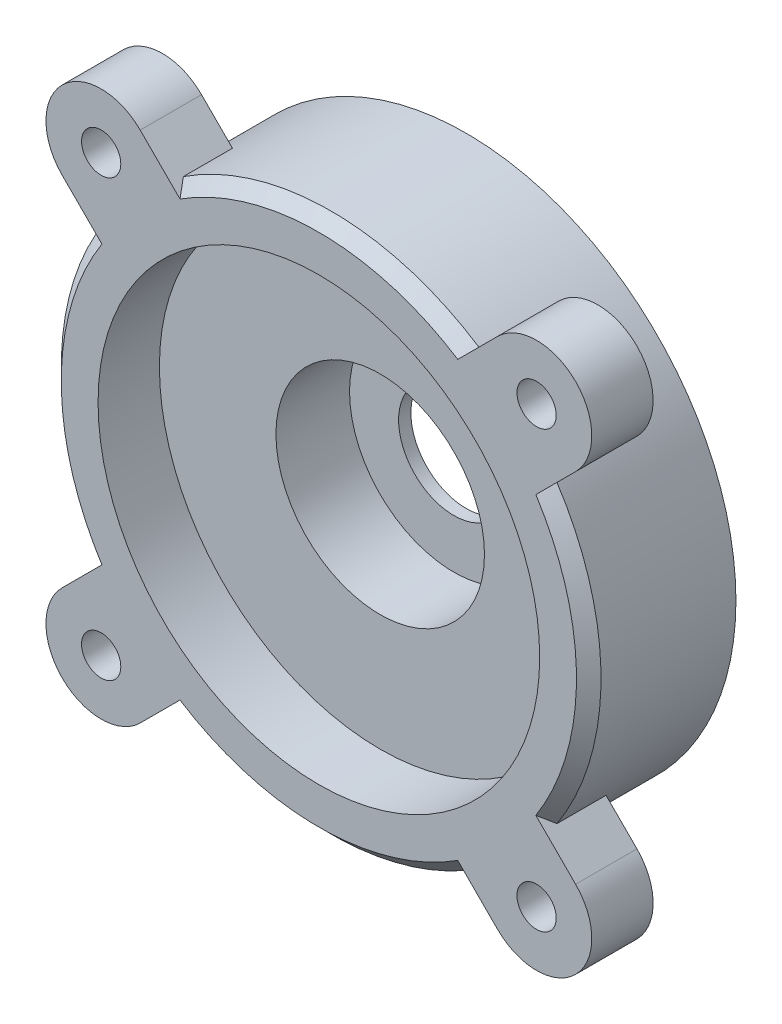
ISO-10303-21;
HEADER;
FILE_DESCRIPTION(('STEP AP214'),'2;1');
FILE_NAME('part.step','',(''),(''),'','','');
FILE_SCHEMA(('AUTOMOTIVE_DESIGN { 1 0 10303 214 1 1 1 1 }'));
ENDSEC;
DATA;
#1=APPLICATION_CONTEXT('core data for automotive mechanical design processes');
#2=APPLICATION_PROTOCOL_DEFINITION('international standard','automotive_design',2000,#1);
#3=PRODUCT_CONTEXT('',#1,'mechanical');
#4=PRODUCT('Part','Part','',(#3));
#5=PRODUCT_RELATED_PRODUCT_CATEGORY('part','',(#4));
#6=PRODUCT_DEFINITION_FORMATION('','',#4);
#7=PRODUCT_DEFINITION_CONTEXT('part definition',#1,'design');
#8=PRODUCT_DEFINITION('design','',#6,#7);
#9=PRODUCT_DEFINITION_SHAPE('','',#8);
#10=(LENGTH_UNIT() NAMED_UNIT(*) SI_UNIT(.MILLI.,.METRE.));
#11=(NAMED_UNIT(*) PLANE_ANGLE_UNIT() SI_UNIT($,.RADIAN.));
#12=(NAMED_UNIT(*) SI_UNIT($,.STERADIAN.) SOLID_ANGLE_UNIT());
#13=UNCERTAINTY_MEASURE_WITH_UNIT(LENGTH_MEASURE(1.E-05),#10,'distance_accuracy_value','');
#14=(GEOMETRIC_REPRESENTATION_CONTEXT(3) GLOBAL_UNCERTAINTY_ASSIGNED_CONTEXT((#13)) GLOBAL_UNIT_ASSIGNED_CONTEXT((#10,
#11,#12)) REPRESENTATION_CONTEXT('',''));
#15=CARTESIAN_POINT('',(0.,0.,0.));
#16=DIRECTION('',(0.,0.,1.));
#17=DIRECTION('',(1.,0.,0.));
#18=AXIS2_PLACEMENT_3D('',#15,#16,#17);
#19=CARTESIAN_POINT('',(0.,0.,6.));
#20=DIRECTION('',(0.,0.,-1.));
#21=DIRECTION('',(-1.,0.,0.));
#22=AXIS2_PLACEMENT_3D('',#19,#20,#21);
#23=CONICAL_SURFACE('',#22,21.,0.785398163397448);
#24=CARTESIAN_POINT('',(-11.3221844044348,17.6861454351131,6.0002));
#25=CARTESIAN_POINT('',(-11.442817573575,17.8067786042533,5.83355757009398));
#26=CARTESIAN_POINT('',(-11.5634193156647,17.9273803463431,5.66686968833641));
#27=CARTESIAN_POINT('',(-11.8045599453449,18.1685209760232,5.33340302166944));
#28=CARTESIAN_POINT('',(-11.9250988329356,18.2890598636139,5.16662423676034));
#29=CARTESIAN_POINT('',(-12.045606293476,18.4095673241543,4.9998));
#30=B_SPLINE_CURVE_WITH_KNOTS('',3,(#24,#25,#26,#27,#28,#29),.UNSPECIFIED.,.F.,.F.,(4,2,4),(0.,
0.715450692106055,1.43090138184667),.UNSPECIFIED.);
#31=CARTESIAN_POINT('',(-11.3223291890206,17.686290219699,6.));
#32=VERTEX_POINT('',#31);
#33=CARTESIAN_POINT('',(-12.045461817502,18.4094228481803,5.00000000000001));
#34=VERTEX_POINT('',#33);
#35=EDGE_CURVE('E716',#32,#34,#30,.T.);
#36=ORIENTED_EDGE('',*,*,#35,.F.);
#37=CARTESIAN_POINT('',(0.,0.,6.));
#38=DIRECTION('',(0.,0.,1.));
#39=DIRECTION('',(1.,0.,0.));
#40=AXIS2_PLACEMENT_3D('',#37,#38,#39);
#41=CIRCLE('',#40,21.);
#42=CARTESIAN_POINT('',(11.3223291890208,17.6862902196998,6.));
#43=VERTEX_POINT('',#42);
#44=EDGE_CURVE('E321',#43,#32,#41,.T.);
#45=ORIENTED_EDGE('',*,*,#44,.F.);
#46=CARTESIAN_POINT('',(12.0456062934756,18.4095673241546,4.99980000000001));
#47=CARTESIAN_POINT('',(11.9250988329352,18.2890598636141,5.16662423676035));
#48=CARTESIAN_POINT('',(11.8045599453445,18.1685209760235,5.33340302166944));
#49=CARTESIAN_POINT('',(11.5634193156643,17.9273803463433,5.66686968833641));
#50=CARTESIAN_POINT('',(11.4428175735746,17.8067786042535,5.83355757009398));
#51=CARTESIAN_POINT('',(11.3221844044344,17.6861454351134,6.0002));
#52=B_SPLINE_CURVE_WITH_KNOTS('',3,(#46,#47,#48,#49,#50,#51),.UNSPECIFIED.,.F.,.F.,(4,2,4),(0.,
0.715450689740613,1.43090138184667),.UNSPECIFIED.);
#53=CARTESIAN_POINT('',(12.0454618175016,18.4094228481805,5.00000000000001));
#54=VERTEX_POINT('',#53);
#55=EDGE_CURVE('E329',#54,#43,#52,.T.);
#56=ORIENTED_EDGE('',*,*,#55,.F.);
#57=CARTESIAN_POINT('',(0.,0.,5.00000000000001));
#58=DIRECTION('',(0.,0.,1.));
#59=DIRECTION('',(1.,0.,0.));
#60=AXIS2_PLACEMENT_3D('',#57,#58,#59);
#61=CIRCLE('',#60,22.);
#62=EDGE_CURVE('E324',#34,#54,#61,.F.);
#63=ORIENTED_EDGE('',*,*,#62,.F.);
#64=EDGE_LOOP('',(#36,#45,#56,#63));
#65=FACE_BOUND('',#64,.T.);
#66=ADVANCED_FACE('F36',(#65),#23,.T.);
#67=CARTESIAN_POINT('',(-18.4095673241548,12.0456062934752,4.99980000000001));
#68=CARTESIAN_POINT('',(-18.2890598636144,11.9250988329348,5.16662423676035));
#69=CARTESIAN_POINT('',(-18.1685209760237,11.8045599453442,5.33340302166944));
#70=CARTESIAN_POINT('',(-17.9273803463436,11.563419315664,5.66686968833641));
#71=CARTESIAN_POINT('',(-17.8067786042538,11.4428175735742,5.83355757009398));
#72=CARTESIAN_POINT('',(-17.6861454351136,11.322184404434,6.0002));
#73=B_SPLINE_CURVE_WITH_KNOTS('',3,(#67,#68,#69,#70,#71,#72),.UNSPECIFIED.,.F.,.F.,(4,2,4),(0.,
0.715450689740612,1.43090138184667),.UNSPECIFIED.);
#74=CARTESIAN_POINT('',(-18.4094228481808,12.0454618175012,5.00000000000001));
#75=VERTEX_POINT('',#74);
#76=CARTESIAN_POINT('',(-17.6862902196996,11.32232918902,6.));
#77=VERTEX_POINT('',#76);
#78=EDGE_CURVE('E209',#75,#77,#73,.T.);
#79=ORIENTED_EDGE('',*,*,#78,.F.);
#80=CARTESIAN_POINT('',(-18.4094228481799,-12.0454618175025,5.00000000000001));
#81=VERTEX_POINT('',#80);
#82=EDGE_CURVE('E754',#81,#75,#61,.F.);
#83=ORIENTED_EDGE('',*,*,#82,.F.);
#84=CARTESIAN_POINT('',(-17.6861454351128,-11.3221844044354,6.0002));
#85=CARTESIAN_POINT('',(-17.8067786042529,-11.4428175735755,5.83355757009397));
#86=CARTESIAN_POINT('',(-17.9273803463427,-11.5634193156653,5.66686968833641));
#87=CARTESIAN_POINT('',(-18.1685209760229,-11.8045599453455,5.33340302166944));
#88=CARTESIAN_POINT('',(-18.2890598636135,-11.9250988329361,5.16662423676035));
#89=CARTESIAN_POINT('',(-18.409567324154,-12.0456062934766,4.99980000000001));
#90=B_SPLINE_CURVE_WITH_KNOTS('',3,(#84,#85,#86,#87,#88,#89),.UNSPECIFIED.,.F.,.F.,(4,2,4),(0.,
0.71545069210605,1.43090138184666),.UNSPECIFIED.);
#91=CARTESIAN_POINT('',(-17.6862902196988,-11.3223291890214,6.));
#92=VERTEX_POINT('',#91);
#93=EDGE_CURVE('E244',#92,#81,#90,.T.);
#94=ORIENTED_EDGE('',*,*,#93,.F.);
#95=EDGE_CURVE('E325',#77,#92,#41,.T.);
#96=ORIENTED_EDGE('',*,*,#95,.F.);
#97=EDGE_LOOP('',(#79,#83,#94,#96));
#98=FACE_BOUND('',#97,.T.);
#99=ADVANCED_FACE('F372',(#98),#23,.T.);
#100=CARTESIAN_POINT('',(-12.0456062934747,-18.4095673241552,4.99980000000001));
#101=CARTESIAN_POINT('',(-11.9250988329342,-18.2890598636147,5.16662423676035));
#102=CARTESIAN_POINT('',(-11.8045599453436,-18.1685209760241,5.33340302166944));
#103=CARTESIAN_POINT('',(-11.5634193156634,-17.9273803463439,5.66686968833641));
#104=CARTESIAN_POINT('',(-11.4428175735736,-17.8067786042541,5.83355757009398));
#105=CARTESIAN_POINT('',(-11.3221844044335,-17.686145435114,6.0002));
#106=B_SPLINE_CURVE_WITH_KNOTS('',3,(#100,#101,#102,#103,#104,#105),.UNSPECIFIED.,.F.,.F.,(4,2,
4),(0.,0.715450689740616,1.43090138184667),.UNSPECIFIED.);
#107=CARTESIAN_POINT('',(-12.0454618175006,-18.4094228481812,5.00000000000001));
#108=VERTEX_POINT('',#107);
#109=CARTESIAN_POINT('',(-11.3223291890198,-17.6862902197004,6.));
#110=VERTEX_POINT('',#109);
#111=EDGE_CURVE('E743',#108,#110,#106,.T.);
#112=ORIENTED_EDGE('',*,*,#111,.F.);
#113=CARTESIAN_POINT('',(12.0454618175022,-18.4094228481801,5.00000000000001));
#114=VERTEX_POINT('',#113);
#115=EDGE_CURVE('E330',#114,#108,#61,.F.);
#116=ORIENTED_EDGE('',*,*,#115,.F.);
#117=CARTESIAN_POINT('',(11.322184404435,-17.686145435113,6.0002));
#118=CARTESIAN_POINT('',(11.4428175735752,-17.8067786042532,5.83355757009398));
#119=CARTESIAN_POINT('',(11.5634193156649,-17.9273803463429,5.66686968833641));
#120=CARTESIAN_POINT('',(11.8045599453451,-18.1685209760231,5.33340302166944));
#121=CARTESIAN_POINT('',(11.9250988329358,-18.2890598636137,5.16662423676035));
#122=CARTESIAN_POINT('',(12.0456062934762,-18.4095673241542,4.99980000000001));
#123=B_SPLINE_CURVE_WITH_KNOTS('',3,(#117,#118,#119,#120,#121,#122),.UNSPECIFIED.,.F.,.F.,(4,2,
4),(0.,0.715450692106052,1.43090138184666),.UNSPECIFIED.);
#124=CARTESIAN_POINT('',(11.3223291890216,-17.6862902196996,6.));
#125=VERTEX_POINT('',#124);
#126=EDGE_CURVE('E396',#125,#114,#123,.T.);
#127=ORIENTED_EDGE('',*,*,#126,.F.);
#128=EDGE_CURVE('E764',#110,#125,#41,.T.);
#129=ORIENTED_EDGE('',*,*,#128,.F.);
#130=EDGE_LOOP('',(#112,#116,#127,#129));
#131=FACE_BOUND('',#130,.T.);
#132=ADVANCED_FACE('F367',(#131),#23,.T.);
#133=CARTESIAN_POINT('',(0.,0.,6.));
#134=DIRECTION('',(0.,0.,-1.));
#135=DIRECTION('',(-1.,0.,0.));
#136=AXIS2_PLACEMENT_3D('',#133,#134,#135);
#137=CYLINDRICAL_SURFACE('',#136,22.);
#138=CARTESIAN_POINT('',(0.,0.,1.));
#139=DIRECTION('',(0.,0.,-1.));
#140=DIRECTION('',(-1.,0.,0.));
#141=AXIS2_PLACEMENT_3D('',#138,#139,#140);
#142=CIRCLE('',#141,22.);
#143=CARTESIAN_POINT('',(-18.4094228481808,12.0454618175012,1.));
#144=VERTEX_POINT('',#143);
#145=CARTESIAN_POINT('',(-12.045461817502,18.4094228481803,1.));
#146=VERTEX_POINT('',#145);
#147=EDGE_CURVE('E11',#144,#146,#142,.T.);
#148=ORIENTED_EDGE('',*,*,#147,.T.);
#149=DIRECTION('',(0.,0.,-1.));
#150=VECTOR('',#149,1.);
#151=CARTESIAN_POINT('',(-12.045461817502,18.4094228481803,6.));
#152=LINE('',#151,#150);
#153=EDGE_CURVE('E216',#146,#34,#152,.F.);
#154=ORIENTED_EDGE('',*,*,#153,.T.);
#155=ORIENTED_EDGE('',*,*,#62,.T.);
#156=DIRECTION('',(0.,0.,-1.));
#157=VECTOR('',#156,1.);
#158=CARTESIAN_POINT('',(12.0454618175016,18.4094228481805,6.));
#159=LINE('',#158,#157);
#160=CARTESIAN_POINT('',(12.0454618175016,18.4094228481805,1.));
#161=VERTEX_POINT('',#160);
#162=EDGE_CURVE('E310',#54,#161,#159,.T.);
#163=ORIENTED_EDGE('',*,*,#162,.T.);
#164=CARTESIAN_POINT('',(0.,0.,1.));
#165=DIRECTION('',(0.,0.,-1.));
#166=DIRECTION('',(-1.,0.,0.));
#167=AXIS2_PLACEMENT_3D('',#164,#165,#166);
#168=CIRCLE('',#167,22.);
#169=CARTESIAN_POINT('',(18.4094228481805,12.0454618175016,1.));
#170=VERTEX_POINT('',#169);
#171=EDGE_CURVE('E397',#161,#170,#168,.T.);
#172=ORIENTED_EDGE('',*,*,#171,.T.);
#173=DIRECTION('',(0.,0.,-1.));
#174=VECTOR('',#173,1.);
#175=CARTESIAN_POINT('',(18.4094228481805,12.0454618175016,6.));
#176=LINE('',#175,#174);
#177=CARTESIAN_POINT('',(18.4094228481805,12.0454618175016,5.00000000000001));
#178=VERTEX_POINT('',#177);
#179=EDGE_CURVE('E314',#170,#178,#176,.F.);
#180=ORIENTED_EDGE('',*,*,#179,.T.);
#181=CARTESIAN_POINT('',(18.4094228481809,-12.045461817501,5.00000000000001));
#182=VERTEX_POINT('',#181);
#183=EDGE_CURVE('E326',#178,#182,#61,.F.);
#184=ORIENTED_EDGE('',*,*,#183,.T.);
#185=DIRECTION('',(0.,0.,-1.));
#186=VECTOR('',#185,1.);
#187=CARTESIAN_POINT('',(18.4094228481809,-12.045461817501,6.));
#188=LINE('',#187,#186);
#189=CARTESIAN_POINT('',(18.4094228481809,-12.045461817501,1.));
#190=VERTEX_POINT('',#189);
#191=EDGE_CURVE('E278',#182,#190,#188,.T.);
#192=ORIENTED_EDGE('',*,*,#191,.T.);
#193=CARTESIAN_POINT('',(0.,0.,1.));
#194=DIRECTION('',(0.,0.,-1.));
#195=DIRECTION('',(-1.,0.,0.));
#196=AXIS2_PLACEMENT_3D('',#193,#194,#195);
#197=CIRCLE('',#196,22.);
#198=CARTESIAN_POINT('',(12.0454618175022,-18.4094228481802,1.));
#199=VERTEX_POINT('',#198);
#200=EDGE_CURVE('E772',#190,#199,#197,.T.);
#201=ORIENTED_EDGE('',*,*,#200,.T.);
#202=DIRECTION('',(0.,0.,-1.));
#203=VECTOR('',#202,1.);
#204=CARTESIAN_POINT('',(12.0454618175022,-18.4094228481801,6.));
#205=LINE('',#204,#203);
#206=EDGE_CURVE('E282',#199,#114,#205,.F.);
#207=ORIENTED_EDGE('',*,*,#206,.T.);
#208=ORIENTED_EDGE('',*,*,#115,.T.);
#209=DIRECTION('',(0.,0.,-1.));
#210=VECTOR('',#209,1.);
#211=CARTESIAN_POINT('',(-12.0454618175006,-18.4094228481812,6.));
#212=LINE('',#211,#210);
#213=CARTESIAN_POINT('',(-12.0454618175006,-18.4094228481812,1.));
#214=VERTEX_POINT('',#213);
#215=EDGE_CURVE('E740',#108,#214,#212,.T.);
#216=ORIENTED_EDGE('',*,*,#215,.T.);
#217=CARTESIAN_POINT('',(0.,0.,1.));
#218=DIRECTION('',(0.,0.,-1.));
#219=DIRECTION('',(-1.,0.,0.));
#220=AXIS2_PLACEMENT_3D('',#217,#218,#219);
#221=CIRCLE('',#220,22.);
#222=CARTESIAN_POINT('',(-18.4094228481799,-12.0454618175025,1.));
#223=VERTEX_POINT('',#222);
#224=EDGE_CURVE('E45',#214,#223,#221,.T.);
#225=ORIENTED_EDGE('',*,*,#224,.T.);
#226=DIRECTION('',(0.,0.,-1.));
#227=VECTOR('',#226,1.);
#228=CARTESIAN_POINT('',(-18.4094228481799,-12.0454618175025,6.));
#229=LINE('',#228,#227);
#230=EDGE_CURVE('E252',#223,#81,#229,.F.);
#231=ORIENTED_EDGE('',*,*,#230,.T.);
#232=ORIENTED_EDGE('',*,*,#82,.T.);
#233=DIRECTION('',(0.,0.,-1.));
#234=VECTOR('',#233,1.);
#235=CARTESIAN_POINT('',(-18.4094228481808,12.0454618175012,6.));
#236=LINE('',#235,#234);
#237=EDGE_CURVE('E206',#75,#144,#236,.T.);
#238=ORIENTED_EDGE('',*,*,#237,.T.);
#239=EDGE_LOOP('',(#148,#154,#155,#163,#172,#180,#184,#192,#201,#207,#208,#216,#225,#231,#232,#238));
#240=FACE_BOUND('',#239,.T.);
#241=CARTESIAN_POINT('',(0.,0.,-6.));
#242=DIRECTION('',(0.,0.,1.));
#243=DIRECTION('',(1.,0.,0.));
#244=AXIS2_PLACEMENT_3D('',#241,#242,#243);
#245=CIRCLE('',#244,22.);
#246=CARTESIAN_POINT('',(22.,0.,-6.));
#247=VERTEX_POINT('',#246);
#248=EDGE_CURVE('E317',#247,#247,#245,.T.);
#249=ORIENTED_EDGE('',*,*,#248,.T.);
#250=EDGE_LOOP('',(#249));
#251=FACE_BOUND('',#250,.T.);
#252=ADVANCED_FACE('F362',(#240,#251),#137,.T.);
#253=CARTESIAN_POINT('',(0.,0.,6.));
#254=DIRECTION('',(0.,0.,1.));
#255=DIRECTION('',(1.,0.,0.));
#256=AXIS2_PLACEMENT_3D('',#253,#254,#255);
#257=PLANE('',#256);
#258=CARTESIAN_POINT('',(0.,0.,6.));
#259=DIRECTION('',(0.,0.,1.));
#260=DIRECTION('',(1.,0.,0.));
#261=AXIS2_PLACEMENT_3D('',#258,#259,#260);
#262=CIRCLE('',#261,18.);
#263=CARTESIAN_POINT('',(18.,0.,6.));
#264=VERTEX_POINT('',#263);
#265=EDGE_CURVE('E690',#264,#264,#262,.T.);
#266=ORIENTED_EDGE('',*,*,#265,.F.);
#267=EDGE_LOOP('',(#266));
#268=FACE_BOUND('',#267,.T.);
#269=ORIENTED_EDGE('',*,*,#44,.T.);
#270=DIRECTION('',(-0.707106781186548,0.707106781186547,0.));
#271=VECTOR('',#270,1.);
#272=CARTESIAN_POINT('',(-14.5663996924429,20.9303607231212,6.));
#273=LINE('',#272,#271);
#274=CARTESIAN_POINT('',(-14.5663996924429,20.9303607231212,6.));
#275=VERTEX_POINT('',#274);
#276=EDGE_CURVE('E193',#32,#275,#273,.T.);
#277=ORIENTED_EDGE('',*,*,#276,.T.);
#278=CARTESIAN_POINT('',(-17.7483802077823,17.7483802077817,6.));
#279=DIRECTION('',(0.,0.,1.));
#280=DIRECTION('',(-1.,0.,0.));
#281=AXIS2_PLACEMENT_3D('',#278,#279,#280);
#282=CIRCLE('',#281,4.50000000000002);
#283=CARTESIAN_POINT('',(-20.9303607231218,14.5663996924422,6.));
#284=VERTEX_POINT('',#283);
#285=EDGE_CURVE('E202',#275,#284,#282,.T.);
#286=ORIENTED_EDGE('',*,*,#285,.T.);
#287=DIRECTION('',(0.707106781186548,-0.707106781186548,0.));
#288=VECTOR('',#287,1.);
#289=CARTESIAN_POINT('',(-20.9303607231218,14.5663996924422,6.));
#290=LINE('',#289,#288);
#291=EDGE_CURVE('E180',#284,#77,#290,.T.);
#292=ORIENTED_EDGE('',*,*,#291,.T.);
#293=ORIENTED_EDGE('',*,*,#95,.T.);
#294=DIRECTION('',(-0.707106781186547,-0.707106781186548,0.));
#295=VECTOR('',#294,1.);
#296=CARTESIAN_POINT('',(-20.930360723121,-14.5663996924436,6.));
#297=LINE('',#296,#295);
#298=CARTESIAN_POINT('',(-20.930360723121,-14.5663996924436,6.));
#299=VERTEX_POINT('',#298);
#300=EDGE_CURVE('E726',#92,#299,#297,.T.);
#301=ORIENTED_EDGE('',*,*,#300,.T.);
#302=CARTESIAN_POINT('',(-17.7483802077815,-17.7483802077831,6.));
#303=DIRECTION('',(0.,0.,1.));
#304=DIRECTION('',(-1.,0.,0.));
#305=AXIS2_PLACEMENT_3D('',#302,#303,#304);
#306=CIRCLE('',#305,4.50000000000002);
#307=CARTESIAN_POINT('',(-14.566399692442,-20.9303607231226,6.));
#308=VERTEX_POINT('',#307);
#309=EDGE_CURVE('E719',#299,#308,#306,.T.);
#310=ORIENTED_EDGE('',*,*,#309,.T.);
#311=DIRECTION('',(0.707106781186547,0.707106781186548,0.));
#312=VECTOR('',#311,1.);
#313=CARTESIAN_POINT('',(-14.566399692442,-20.9303607231226,6.));
#314=LINE('',#313,#312);
#315=EDGE_CURVE('E733',#308,#110,#314,.T.);
#316=ORIENTED_EDGE('',*,*,#315,.T.);
#317=ORIENTED_EDGE('',*,*,#128,.T.);
#318=DIRECTION('',(0.707106781186548,-0.707106781186547,0.));
#319=VECTOR('',#318,1.);
#320=CARTESIAN_POINT('',(14.5663996924438,-20.9303607231218,6.));
#321=LINE('',#320,#319);
#322=CARTESIAN_POINT('',(14.5663996924438,-20.9303607231218,6.));
#323=VERTEX_POINT('',#322);
#324=EDGE_CURVE('E264',#125,#323,#321,.T.);
#325=ORIENTED_EDGE('',*,*,#324,.T.);
#326=CARTESIAN_POINT('',(17.7483802077833,-17.7483802077823,6.));
#327=DIRECTION('',(0.,0.,1.));
#328=DIRECTION('',(-1.,0.,0.));
#329=AXIS2_PLACEMENT_3D('',#326,#327,#328);
#330=CIRCLE('',#329,4.50000000000002);
#331=CARTESIAN_POINT('',(20.9303607231227,-14.5663996924428,6.));
#332=VERTEX_POINT('',#331);
#333=EDGE_CURVE('E257',#323,#332,#330,.T.);
#334=ORIENTED_EDGE('',*,*,#333,.T.);
#335=DIRECTION('',(-0.707106781186548,0.707106781186547,0.));
#336=VECTOR('',#335,1.);
#337=CARTESIAN_POINT('',(20.9303607231227,-14.5663996924428,6.));
#338=LINE('',#337,#336);
#339=CARTESIAN_POINT('',(17.6862902196987,-11.3223291890225,6.));
#340=VERTEX_POINT('',#339);
#341=EDGE_CURVE('E272',#332,#340,#338,.T.);
#342=ORIENTED_EDGE('',*,*,#341,.T.);
#343=CARTESIAN_POINT('',(17.6862902196998,11.3223291890208,6.));
#344=VERTEX_POINT('',#343);
#345=EDGE_CURVE('E320',#340,#344,#41,.T.);
#346=ORIENTED_EDGE('',*,*,#345,.T.);
#347=DIRECTION('',(0.707106781186547,0.707106781186548,0.));
#348=VECTOR('',#347,1.);
#349=CARTESIAN_POINT('',(20.930360723122,14.566399692443,6.));
#350=LINE('',#349,#348);
#351=CARTESIAN_POINT('',(20.930360723122,14.566399692443,6.));
#352=VERTEX_POINT('',#351);
#353=EDGE_CURVE('E296',#344,#352,#350,.T.);
#354=ORIENTED_EDGE('',*,*,#353,.T.);
#355=CARTESIAN_POINT('',(17.7483802077825,17.7483802077825,6.));
#356=DIRECTION('',(0.,0.,1.));
#357=DIRECTION('',(-1.,0.,0.));
#358=AXIS2_PLACEMENT_3D('',#355,#356,#357);
#359=CIRCLE('',#358,4.50000000000002);
#360=CARTESIAN_POINT('',(14.566399692443,20.930360723122,6.));
#361=VERTEX_POINT('',#360);
#362=EDGE_CURVE('E289',#352,#361,#359,.T.);
#363=ORIENTED_EDGE('',*,*,#362,.T.);
#364=DIRECTION('',(-0.707106781186547,-0.707106781186548,0.));
#365=VECTOR('',#364,1.);
#366=CARTESIAN_POINT('',(14.566399692443,20.930360723122,6.));
#367=LINE('',#366,#365);
#368=EDGE_CURVE('E304',#361,#43,#367,.T.);
#369=ORIENTED_EDGE('',*,*,#368,.T.);
#370=EDGE_LOOP('',(#269,#277,#286,#292,#293,#301,#310,#316,#317,#325,#334,#342,#346,#354,#363,#369));
#371=FACE_BOUND('',#370,.T.);
#372=CARTESIAN_POINT('',(17.7483802077825,17.7483802077825,6.));
#373=DIRECTION('',(0.,0.,1.));
#374=DIRECTION('',(1.,0.,0.));
#375=AXIS2_PLACEMENT_3D('',#372,#373,#374);
#376=CIRCLE('',#375,1.59999999999981);
#377=CARTESIAN_POINT('',(19.3483802077823,17.7483802077825,6.));
#378=VERTEX_POINT('',#377);
#379=EDGE_CURVE('E285',#378,#378,#376,.T.);
#380=ORIENTED_EDGE('',*,*,#379,.F.);
#381=EDGE_LOOP('',(#380));
#382=FACE_BOUND('',#381,.T.);
#383=CARTESIAN_POINT('',(17.7483802077833,-17.7483802077823,6.));
#384=DIRECTION('',(0.,0.,1.));
#385=DIRECTION('',(1.,0.,0.));
#386=AXIS2_PLACEMENT_3D('',#383,#384,#385);
#387=CIRCLE('',#386,1.59999999999979);
#388=CARTESIAN_POINT('',(19.3483802077831,-17.7483802077823,6.));
#389=VERTEX_POINT('',#388);
#390=EDGE_CURVE('E251',#389,#389,#387,.T.);
#391=ORIENTED_EDGE('',*,*,#390,.F.);
#392=EDGE_LOOP('',(#391));
#393=FACE_BOUND('',#392,.T.);
#394=CARTESIAN_POINT('',(-17.7483802077815,-17.7483802077831,6.));
#395=DIRECTION('',(0.,0.,1.));
#396=DIRECTION('',(1.,0.,0.));
#397=AXIS2_PLACEMENT_3D('',#394,#395,#396);
#398=CIRCLE('',#397,1.60000000000064);
#399=CARTESIAN_POINT('',(-16.1483802077809,-17.7483802077831,6.));
#400=VERTEX_POINT('',#399);
#401=EDGE_CURVE('E713',#400,#400,#398,.T.);
#402=ORIENTED_EDGE('',*,*,#401,.F.);
#403=EDGE_LOOP('',(#402));
#404=FACE_BOUND('',#403,.T.);
#405=CARTESIAN_POINT('',(-17.7483802077823,17.7483802077817,6.));
#406=DIRECTION('',(0.,0.,1.));
#407=DIRECTION('',(1.,0.,0.));
#408=AXIS2_PLACEMENT_3D('',#405,#406,#407);
#409=CIRCLE('',#408,1.60000000000074);
#410=CARTESIAN_POINT('',(-16.1483802077816,17.7483802077817,6.));
#411=VERTEX_POINT('',#410);
#412=EDGE_CURVE('E198',#411,#411,#409,.T.);
#413=ORIENTED_EDGE('',*,*,#412,.F.);
#414=EDGE_LOOP('',(#413));
#415=FACE_BOUND('',#414,.T.);
#416=ADVANCED_FACE('F358',(#268,#371,#382,#393,#404,#415),#257,.T.);
#417=CARTESIAN_POINT('',(0.,0.,-6.));
#418=DIRECTION('',(0.,0.,1.));
#419=DIRECTION('',(1.,0.,0.));
#420=AXIS2_PLACEMENT_3D('',#417,#418,#419);
#421=PLANE('',#420);
#422=CARTESIAN_POINT('',(0.,0.,-6.));
#423=DIRECTION('',(0.,0.,1.));
#424=DIRECTION('',(1.,0.,0.));
#425=AXIS2_PLACEMENT_3D('',#422,#423,#424);
#426=CIRCLE('',#425,4.5);
#427=CARTESIAN_POINT('',(4.5,0.,-6.));
#428=VERTEX_POINT('',#427);
#429=EDGE_CURVE('E679',#428,#428,#426,.T.);
#430=ORIENTED_EDGE('',*,*,#429,.T.);
#431=EDGE_LOOP('',(#430));
#432=FACE_BOUND('',#431,.T.);
#433=ORIENTED_EDGE('',*,*,#248,.F.);
#434=EDGE_LOOP('',(#433));
#435=FACE_BOUND('',#434,.T.);
#436=ADVANCED_FACE('F361',(#432,#435),#421,.F.);
#437=CARTESIAN_POINT('',(18.409567324155,-12.045606293475,4.99980000000001));
#438=CARTESIAN_POINT('',(18.2890598636145,-11.9250988329346,5.16662423676035));
#439=CARTESIAN_POINT('',(18.1685209760239,-11.804559945344,5.33340302166944));
#440=CARTESIAN_POINT('',(17.9273803463437,-11.5634193156638,5.66686968833641));
#441=CARTESIAN_POINT('',(17.8067786042539,-11.442817573574,5.83355757009398));
#442=CARTESIAN_POINT('',(17.6861454351138,-11.3221844044338,6.0002));
#443=B_SPLINE_CURVE_WITH_KNOTS('',3,(#437,#438,#439,#440,#441,#442),.UNSPECIFIED.,.F.,.F.,(4,2,
4),(0.,0.715450689740612,1.43090138184667),.UNSPECIFIED.);
#444=EDGE_CURVE('E392',#182,#340,#443,.T.);
#445=ORIENTED_EDGE('',*,*,#444,.F.);
#446=ORIENTED_EDGE('',*,*,#183,.F.);
#447=CARTESIAN_POINT('',(17.6861454351134,11.3221844044344,6.0002));
#448=CARTESIAN_POINT('',(17.8067786042535,11.4428175735746,5.83355757009397));
#449=CARTESIAN_POINT('',(17.9273803463433,11.5634193156644,5.6668696883364));
#450=CARTESIAN_POINT('',(18.1685209760235,11.8045599453445,5.33340302166944));
#451=CARTESIAN_POINT('',(18.2890598636141,11.9250988329352,5.16662423676034));
#452=CARTESIAN_POINT('',(18.4095673241546,12.0456062934756,4.9998));
#453=B_SPLINE_CURVE_WITH_KNOTS('',3,(#447,#448,#449,#450,#451,#452),.UNSPECIFIED.,.F.,.F.,(4,2,
4),(0.,0.715450692106056,1.43090138184667),.UNSPECIFIED.);
#454=EDGE_CURVE('E338',#344,#178,#453,.T.);
#455=ORIENTED_EDGE('',*,*,#454,.F.);
#456=ORIENTED_EDGE('',*,*,#345,.F.);
#457=EDGE_LOOP('',(#445,#446,#455,#456));
#458=FACE_BOUND('',#457,.T.);
#459=ADVANCED_FACE('F38',(#458),#23,.T.);
#460=CARTESIAN_POINT('',(20.930360723122,14.566399692443,1.));
#461=DIRECTION('',(0.707106781186548,-0.707106781186547,0.));
#462=DIRECTION('',(0.707106781186547,0.707106781186548,0.));
#463=AXIS2_PLACEMENT_3D('',#460,#461,#462);
#464=PLANE('',#463);
#465=ORIENTED_EDGE('',*,*,#179,.F.);
#466=DIRECTION('',(0.707106781186547,0.707106781186548,0.));
#467=VECTOR('',#466,1.);
#468=CARTESIAN_POINT('',(20.930360723122,14.566399692443,1.));
#469=LINE('',#468,#467);
#470=CARTESIAN_POINT('',(20.930360723122,14.566399692443,1.));
#471=VERTEX_POINT('',#470);
#472=EDGE_CURVE('E299',#170,#471,#469,.T.);
#473=ORIENTED_EDGE('',*,*,#472,.T.);
#474=DIRECTION('',(0.,0.,1.));
#475=VECTOR('',#474,1.);
#476=CARTESIAN_POINT('',(20.930360723122,14.566399692443,1.));
#477=LINE('',#476,#475);
#478=EDGE_CURVE('E308',#471,#352,#477,.T.);
#479=ORIENTED_EDGE('',*,*,#478,.T.);
#480=ORIENTED_EDGE('',*,*,#353,.F.);
#481=ORIENTED_EDGE('',*,*,#454,.T.);
#482=EDGE_LOOP('',(#465,#473,#479,#480,#481));
#483=FACE_BOUND('',#482,.T.);
#484=ADVANCED_FACE('F350',(#483),#464,.T.);
#485=CARTESIAN_POINT('',(14.566399692443,20.930360723122,1.));
#486=DIRECTION('',(-0.707106781186548,0.707106781186547,0.));
#487=DIRECTION('',(-0.707106781186547,-0.707106781186548,0.));
#488=AXIS2_PLACEMENT_3D('',#485,#486,#487);
#489=PLANE('',#488);
#490=ORIENTED_EDGE('',*,*,#162,.F.);
#491=ORIENTED_EDGE('',*,*,#55,.T.);
#492=ORIENTED_EDGE('',*,*,#368,.F.);
#493=DIRECTION('',(0.,0.,1.));
#494=VECTOR('',#493,1.);
#495=CARTESIAN_POINT('',(14.566399692443,20.930360723122,1.));
#496=LINE('',#495,#494);
#497=CARTESIAN_POINT('',(14.566399692443,20.930360723122,1.));
#498=VERTEX_POINT('',#497);
#499=EDGE_CURVE('E301',#498,#361,#496,.T.);
#500=ORIENTED_EDGE('',*,*,#499,.F.);
#501=DIRECTION('',(-0.707106781186547,-0.707106781186548,0.));
#502=VECTOR('',#501,1.);
#503=CARTESIAN_POINT('',(14.566399692443,20.930360723122,1.));
#504=LINE('',#503,#502);
#505=EDGE_CURVE('E295',#498,#161,#504,.T.);
#506=ORIENTED_EDGE('',*,*,#505,.T.);
#507=EDGE_LOOP('',(#490,#491,#492,#500,#506));
#508=FACE_BOUND('',#507,.T.);
#509=ADVANCED_FACE('F345',(#508),#489,.T.);
#510=CARTESIAN_POINT('',(17.7483802077825,17.7483802077825,1.));
#511=DIRECTION('',(0.,0.,1.));
#512=DIRECTION('',(1.,0.,0.));
#513=AXIS2_PLACEMENT_3D('',#510,#511,#512);
#514=CYLINDRICAL_SURFACE('',#513,4.50000000000002);
#515=ORIENTED_EDGE('',*,*,#362,.F.);
#516=ORIENTED_EDGE('',*,*,#478,.F.);
#517=CARTESIAN_POINT('',(17.7483802077825,17.7483802077825,1.));
#518=DIRECTION('',(0.,0.,1.));
#519=DIRECTION('',(-1.,0.,0.));
#520=AXIS2_PLACEMENT_3D('',#517,#518,#519);
#521=CIRCLE('',#520,4.50000000000002);
#522=EDGE_CURVE('E292',#471,#498,#521,.T.);
#523=ORIENTED_EDGE('',*,*,#522,.T.);
#524=ORIENTED_EDGE('',*,*,#499,.T.);
#525=EDGE_LOOP('',(#515,#516,#523,#524));
#526=FACE_BOUND('',#525,.T.);
#527=ADVANCED_FACE('F349',(#526),#514,.T.);
#528=CARTESIAN_POINT('',(17.7483802077825,17.7483802077825,1.));
#529=DIRECTION('',(0.,0.,-1.));
#530=DIRECTION('',(-1.,0.,0.));
#531=AXIS2_PLACEMENT_3D('',#528,#529,#530);
#532=PLANE('',#531);
#533=ORIENTED_EDGE('',*,*,#171,.F.);
#534=ORIENTED_EDGE('',*,*,#505,.F.);
#535=ORIENTED_EDGE('',*,*,#522,.F.);
#536=ORIENTED_EDGE('',*,*,#472,.F.);
#537=EDGE_LOOP('',(#533,#534,#535,#536));
#538=FACE_BOUND('',#537,.T.);
#539=CARTESIAN_POINT('',(17.7483802077825,17.7483802077825,1.));
#540=DIRECTION('',(0.,0.,1.));
#541=DIRECTION('',(1.,0.,0.));
#542=AXIS2_PLACEMENT_3D('',#539,#540,#541);
#543=CIRCLE('',#542,1.59999999999981);
#544=CARTESIAN_POINT('',(19.3483802077823,17.7483802077825,1.));
#545=VERTEX_POINT('',#544);
#546=EDGE_CURVE('E286',#545,#545,#543,.T.);
#547=ORIENTED_EDGE('',*,*,#546,.T.);
#548=EDGE_LOOP('',(#547));
#549=FACE_BOUND('',#548,.T.);
#550=ADVANCED_FACE('F356',(#538,#549),#532,.T.);
#551=CARTESIAN_POINT('',(17.7483802077825,17.7483802077825,1.));
#552=DIRECTION('',(0.,0.,1.));
#553=DIRECTION('',(1.,0.,0.));
#554=AXIS2_PLACEMENT_3D('',#551,#552,#553);
#555=CYLINDRICAL_SURFACE('',#554,1.59999999999981);
#556=ORIENTED_EDGE('',*,*,#546,.F.);
#557=EDGE_LOOP('',(#556));
#558=FACE_BOUND('',#557,.T.);
#559=ORIENTED_EDGE('',*,*,#379,.T.);
#560=EDGE_LOOP('',(#559));
#561=FACE_BOUND('',#560,.T.);
#562=ADVANCED_FACE('F435',(#558,#561),#555,.F.);
#563=CARTESIAN_POINT('',(14.5663996924438,-20.9303607231218,1.));
#564=DIRECTION('',(-0.707106781186547,-0.707106781186548,0.));
#565=DIRECTION('',(0.707106781186548,-0.707106781186547,0.));
#566=AXIS2_PLACEMENT_3D('',#563,#564,#565);
#567=PLANE('',#566);
#568=ORIENTED_EDGE('',*,*,#206,.F.);
#569=DIRECTION('',(0.707106781186548,-0.707106781186547,0.));
#570=VECTOR('',#569,1.);
#571=CARTESIAN_POINT('',(14.5663996924438,-20.9303607231218,1.));
#572=LINE('',#571,#570);
#573=CARTESIAN_POINT('',(14.5663996924438,-20.9303607231218,1.));
#574=VERTEX_POINT('',#573);
#575=EDGE_CURVE('E267',#199,#574,#572,.T.);
#576=ORIENTED_EDGE('',*,*,#575,.T.);
#577=DIRECTION('',(0.,0.,1.));
#578=VECTOR('',#577,1.);
#579=CARTESIAN_POINT('',(14.5663996924438,-20.9303607231218,1.));
#580=LINE('',#579,#578);
#581=EDGE_CURVE('E276',#574,#323,#580,.T.);
#582=ORIENTED_EDGE('',*,*,#581,.T.);
#583=ORIENTED_EDGE('',*,*,#324,.F.);
#584=ORIENTED_EDGE('',*,*,#126,.T.);
#585=EDGE_LOOP('',(#568,#576,#582,#583,#584));
#586=FACE_BOUND('',#585,.T.);
#587=ADVANCED_FACE('F428',(#586),#567,.T.);
#588=CARTESIAN_POINT('',(20.9303607231227,-14.5663996924428,1.));
#589=DIRECTION('',(0.707106781186547,0.707106781186548,0.));
#590=DIRECTION('',(-0.707106781186548,0.707106781186547,0.));
#591=AXIS2_PLACEMENT_3D('',#588,#589,#590);
#592=PLANE('',#591);
#593=ORIENTED_EDGE('',*,*,#191,.F.);
#594=ORIENTED_EDGE('',*,*,#444,.T.);
#595=ORIENTED_EDGE('',*,*,#341,.F.);
#596=DIRECTION('',(0.,0.,1.));
#597=VECTOR('',#596,1.);
#598=CARTESIAN_POINT('',(20.9303607231227,-14.5663996924428,1.));
#599=LINE('',#598,#597);
#600=CARTESIAN_POINT('',(20.9303607231227,-14.5663996924428,1.));
#601=VERTEX_POINT('',#600);
#602=EDGE_CURVE('E269',#601,#332,#599,.T.);
#603=ORIENTED_EDGE('',*,*,#602,.F.);
#604=DIRECTION('',(-0.707106781186548,0.707106781186547,0.));
#605=VECTOR('',#604,1.);
#606=CARTESIAN_POINT('',(20.9303607231227,-14.5663996924428,1.));
#607=LINE('',#606,#605);
#608=EDGE_CURVE('E263',#601,#190,#607,.T.);
#609=ORIENTED_EDGE('',*,*,#608,.T.);
#610=EDGE_LOOP('',(#593,#594,#595,#603,#609));
#611=FACE_BOUND('',#610,.T.);
#612=ADVANCED_FACE('F423',(#611),#592,.T.);
#613=CARTESIAN_POINT('',(17.7483802077833,-17.7483802077823,1.));
#614=DIRECTION('',(0.,0.,1.));
#615=DIRECTION('',(1.,0.,0.));
#616=AXIS2_PLACEMENT_3D('',#613,#614,#615);
#617=CYLINDRICAL_SURFACE('',#616,4.50000000000002);
#618=ORIENTED_EDGE('',*,*,#333,.F.);
#619=ORIENTED_EDGE('',*,*,#581,.F.);
#620=CARTESIAN_POINT('',(17.7483802077833,-17.7483802077823,1.));
#621=DIRECTION('',(0.,0.,1.));
#622=DIRECTION('',(-1.,0.,0.));
#623=AXIS2_PLACEMENT_3D('',#620,#621,#622);
#624=CIRCLE('',#623,4.50000000000002);
#625=EDGE_CURVE('E260',#574,#601,#624,.T.);
#626=ORIENTED_EDGE('',*,*,#625,.T.);
#627=ORIENTED_EDGE('',*,*,#602,.T.);
#628=EDGE_LOOP('',(#618,#619,#626,#627));
#629=FACE_BOUND('',#628,.T.);
#630=ADVANCED_FACE('F427',(#629),#617,.T.);
#631=CARTESIAN_POINT('',(17.7483802077833,-17.7483802077823,1.));
#632=DIRECTION('',(0.,0.,-1.));
#633=DIRECTION('',(-1.,0.,0.));
#634=AXIS2_PLACEMENT_3D('',#631,#632,#633);
#635=PLANE('',#634);
#636=ORIENTED_EDGE('',*,*,#200,.F.);
#637=ORIENTED_EDGE('',*,*,#608,.F.);
#638=ORIENTED_EDGE('',*,*,#625,.F.);
#639=ORIENTED_EDGE('',*,*,#575,.F.);
#640=EDGE_LOOP('',(#636,#637,#638,#639));
#641=FACE_BOUND('',#640,.T.);
#642=CARTESIAN_POINT('',(17.7483802077833,-17.7483802077823,1.));
#643=DIRECTION('',(0.,0.,1.));
#644=DIRECTION('',(1.,0.,0.));
#645=AXIS2_PLACEMENT_3D('',#642,#643,#644);
#646=CIRCLE('',#645,1.59999999999979);
#647=CARTESIAN_POINT('',(19.3483802077831,-17.7483802077823,1.));
#648=VERTEX_POINT('',#647);
#649=EDGE_CURVE('E254',#648,#648,#646,.T.);
#650=ORIENTED_EDGE('',*,*,#649,.T.);
#651=EDGE_LOOP('',(#650));
#652=FACE_BOUND('',#651,.T.);
#653=ADVANCED_FACE('F433',(#641,#652),#635,.T.);
#654=CARTESIAN_POINT('',(17.7483802077833,-17.7483802077823,1.));
#655=DIRECTION('',(0.,0.,1.));
#656=DIRECTION('',(1.,0.,0.));
#657=AXIS2_PLACEMENT_3D('',#654,#655,#656);
#658=CYLINDRICAL_SURFACE('',#657,1.59999999999979);
#659=ORIENTED_EDGE('',*,*,#649,.F.);
#660=EDGE_LOOP('',(#659));
#661=FACE_BOUND('',#660,.T.);
#662=ORIENTED_EDGE('',*,*,#390,.T.);
#663=EDGE_LOOP('',(#662));
#664=FACE_BOUND('',#663,.T.);
#665=ADVANCED_FACE('F467',(#661,#664),#658,.F.);
#666=CARTESIAN_POINT('',(-17.7483802077815,-17.7483802077831,1.));
#667=DIRECTION('',(0.,0.,1.));
#668=DIRECTION('',(1.,0.,0.));
#669=AXIS2_PLACEMENT_3D('',#666,#667,#668);
#670=CYLINDRICAL_SURFACE('',#669,4.50000000000002);
#671=ORIENTED_EDGE('',*,*,#309,.F.);
#672=DIRECTION('',(0.,0.,1.));
#673=VECTOR('',#672,1.);
#674=CARTESIAN_POINT('',(-20.930360723121,-14.5663996924436,1.));
#675=LINE('',#674,#673);
#676=CARTESIAN_POINT('',(-20.930360723121,-14.5663996924436,1.));
#677=VERTEX_POINT('',#676);
#678=EDGE_CURVE('E738',#677,#299,#675,.T.);
#679=ORIENTED_EDGE('',*,*,#678,.F.);
#680=CARTESIAN_POINT('',(-17.7483802077815,-17.7483802077831,1.));
#681=DIRECTION('',(0.,0.,1.));
#682=DIRECTION('',(-1.,0.,0.));
#683=AXIS2_PLACEMENT_3D('',#680,#681,#682);
#684=CIRCLE('',#683,4.50000000000002);
#685=CARTESIAN_POINT('',(-14.566399692442,-20.9303607231226,1.));
#686=VERTEX_POINT('',#685);
#687=EDGE_CURVE('E722',#677,#686,#684,.T.);
#688=ORIENTED_EDGE('',*,*,#687,.T.);
#689=DIRECTION('',(0.,0.,1.));
#690=VECTOR('',#689,1.);
#691=CARTESIAN_POINT('',(-14.566399692442,-20.9303607231226,1.));
#692=LINE('',#691,#690);
#693=EDGE_CURVE('E730',#686,#308,#692,.T.);
#694=ORIENTED_EDGE('',*,*,#693,.T.);
#695=EDGE_LOOP('',(#671,#679,#688,#694));
#696=FACE_BOUND('',#695,.T.);
#697=ADVANCED_FACE('F239',(#696),#670,.T.);
#698=CARTESIAN_POINT('',(-20.930360723121,-14.5663996924436,1.));
#699=DIRECTION('',(-0.707106781186548,0.707106781186547,0.));
#700=DIRECTION('',(-0.707106781186547,-0.707106781186548,0.));
#701=AXIS2_PLACEMENT_3D('',#698,#699,#700);
#702=PLANE('',#701);
#703=ORIENTED_EDGE('',*,*,#300,.F.);
#704=ORIENTED_EDGE('',*,*,#93,.T.);
#705=ORIENTED_EDGE('',*,*,#230,.F.);
#706=DIRECTION('',(-0.707106781186547,-0.707106781186548,0.));
#707=VECTOR('',#706,1.);
#708=CARTESIAN_POINT('',(-20.930360723121,-14.5663996924436,1.));
#709=LINE('',#708,#707);
#710=EDGE_CURVE('E60',#223,#677,#709,.T.);
#711=ORIENTED_EDGE('',*,*,#710,.T.);
#712=ORIENTED_EDGE('',*,*,#678,.T.);
#713=EDGE_LOOP('',(#703,#704,#705,#711,#712));
#714=FACE_BOUND('',#713,.T.);
#715=ADVANCED_FACE('F235',(#714),#702,.T.);
#716=CARTESIAN_POINT('',(-14.566399692442,-20.9303607231226,1.));
#717=DIRECTION('',(0.707106781186548,-0.707106781186547,0.));
#718=DIRECTION('',(0.707106781186547,0.707106781186548,0.));
#719=AXIS2_PLACEMENT_3D('',#716,#717,#718);
#720=PLANE('',#719);
#721=ORIENTED_EDGE('',*,*,#215,.F.);
#722=ORIENTED_EDGE('',*,*,#111,.T.);
#723=ORIENTED_EDGE('',*,*,#315,.F.);
#724=ORIENTED_EDGE('',*,*,#693,.F.);
#725=DIRECTION('',(0.707106781186547,0.707106781186548,0.));
#726=VECTOR('',#725,1.);
#727=CARTESIAN_POINT('',(-14.566399692442,-20.9303607231226,1.));
#728=LINE('',#727,#726);
#729=EDGE_CURVE('E725',#686,#214,#728,.T.);
#730=ORIENTED_EDGE('',*,*,#729,.T.);
#731=EDGE_LOOP('',(#721,#722,#723,#724,#730));
#732=FACE_BOUND('',#731,.T.);
#733=ADVANCED_FACE('F234',(#732),#720,.T.);
#734=CARTESIAN_POINT('',(-17.7483802077815,-17.7483802077831,1.));
#735=DIRECTION('',(0.,0.,-1.));
#736=DIRECTION('',(-1.,0.,0.));
#737=AXIS2_PLACEMENT_3D('',#734,#735,#736);
#738=PLANE('',#737);
#739=ORIENTED_EDGE('',*,*,#224,.F.);
#740=ORIENTED_EDGE('',*,*,#729,.F.);
#741=ORIENTED_EDGE('',*,*,#687,.F.);
#742=ORIENTED_EDGE('',*,*,#710,.F.);
#743=EDGE_LOOP('',(#739,#740,#741,#742));
#744=FACE_BOUND('',#743,.T.);
#745=CARTESIAN_POINT('',(-17.7483802077815,-17.7483802077831,1.));
#746=DIRECTION('',(0.,0.,1.));
#747=DIRECTION('',(1.,0.,0.));
#748=AXIS2_PLACEMENT_3D('',#745,#746,#747);
#749=CIRCLE('',#748,1.60000000000064);
#750=CARTESIAN_POINT('',(-16.1483802077809,-17.7483802077831,1.));
#751=VERTEX_POINT('',#750);
#752=EDGE_CURVE('E715',#751,#751,#749,.T.);
#753=ORIENTED_EDGE('',*,*,#752,.T.);
#754=EDGE_LOOP('',(#753));
#755=FACE_BOUND('',#754,.T.);
#756=ADVANCED_FACE('F230',(#744,#755),#738,.T.);
#757=CARTESIAN_POINT('',(-17.7483802077815,-17.7483802077831,1.));
#758=DIRECTION('',(0.,0.,1.));
#759=DIRECTION('',(1.,0.,0.));
#760=AXIS2_PLACEMENT_3D('',#757,#758,#759);
#761=CYLINDRICAL_SURFACE('',#760,1.60000000000064);
#762=ORIENTED_EDGE('',*,*,#752,.F.);
#763=EDGE_LOOP('',(#762));
#764=FACE_BOUND('',#763,.T.);
#765=ORIENTED_EDGE('',*,*,#401,.T.);
#766=EDGE_LOOP('',(#765));
#767=FACE_BOUND('',#766,.T.);
#768=ADVANCED_FACE('F227',(#764,#767),#761,.F.);
#769=CARTESIAN_POINT('',(-17.7483802077823,17.7483802077817,1.));
#770=DIRECTION('',(0.,0.,1.));
#771=DIRECTION('',(1.,0.,0.));
#772=AXIS2_PLACEMENT_3D('',#769,#770,#771);
#773=CYLINDRICAL_SURFACE('',#772,4.50000000000002);
#774=ORIENTED_EDGE('',*,*,#285,.F.);
#775=DIRECTION('',(0.,0.,1.));
#776=VECTOR('',#775,1.);
#777=CARTESIAN_POINT('',(-14.5663996924429,20.9303607231212,1.));
#778=LINE('',#777,#776);
#779=CARTESIAN_POINT('',(-14.5663996924429,20.9303607231212,1.));
#780=VERTEX_POINT('',#779);
#781=EDGE_CURVE('E185',#780,#275,#778,.T.);
#782=ORIENTED_EDGE('',*,*,#781,.F.);
#783=CARTESIAN_POINT('',(-17.7483802077823,17.7483802077817,1.));
#784=DIRECTION('',(0.,0.,1.));
#785=DIRECTION('',(-1.,0.,0.));
#786=AXIS2_PLACEMENT_3D('',#783,#784,#785);
#787=CIRCLE('',#786,4.50000000000002);
#788=CARTESIAN_POINT('',(-20.9303607231218,14.5663996924422,1.));
#789=VERTEX_POINT('',#788);
#790=EDGE_CURVE('E189',#780,#789,#787,.T.);
#791=ORIENTED_EDGE('',*,*,#790,.T.);
#792=DIRECTION('',(0.,0.,1.));
#793=VECTOR('',#792,1.);
#794=CARTESIAN_POINT('',(-20.9303607231218,14.5663996924422,1.));
#795=LINE('',#794,#793);
#796=EDGE_CURVE('E174',#789,#284,#795,.T.);
#797=ORIENTED_EDGE('',*,*,#796,.T.);
#798=EDGE_LOOP('',(#774,#782,#791,#797));
#799=FACE_BOUND('',#798,.T.);
#800=ADVANCED_FACE('F192',(#799),#773,.T.);
#801=CARTESIAN_POINT('',(-14.5663996924429,20.9303607231212,1.));
#802=DIRECTION('',(0.707106781186547,0.707106781186548,0.));
#803=DIRECTION('',(-0.707106781186548,0.707106781186547,0.));
#804=AXIS2_PLACEMENT_3D('',#801,#802,#803);
#805=PLANE('',#804);
#806=ORIENTED_EDGE('',*,*,#276,.F.);
#807=ORIENTED_EDGE('',*,*,#35,.T.);
#808=ORIENTED_EDGE('',*,*,#153,.F.);
#809=DIRECTION('',(-0.707106781186548,0.707106781186547,0.));
#810=VECTOR('',#809,1.);
#811=CARTESIAN_POINT('',(-14.5663996924429,20.9303607231212,1.));
#812=LINE('',#811,#810);
#813=EDGE_CURVE('E52',#146,#780,#812,.T.);
#814=ORIENTED_EDGE('',*,*,#813,.T.);
#815=ORIENTED_EDGE('',*,*,#781,.T.);
#816=EDGE_LOOP('',(#806,#807,#808,#814,#815));
#817=FACE_BOUND('',#816,.T.);
#818=ADVANCED_FACE('F222',(#817),#805,.T.);
#819=CARTESIAN_POINT('',(-20.9303607231218,14.5663996924422,1.));
#820=DIRECTION('',(-0.707106781186548,-0.707106781186548,0.));
#821=DIRECTION('',(0.707106781186548,-0.707106781186548,0.));
#822=AXIS2_PLACEMENT_3D('',#819,#820,#821);
#823=PLANE('',#822);
#824=ORIENTED_EDGE('',*,*,#237,.F.);
#825=ORIENTED_EDGE('',*,*,#78,.T.);
#826=ORIENTED_EDGE('',*,*,#291,.F.);
#827=ORIENTED_EDGE('',*,*,#796,.F.);
#828=DIRECTION('',(0.707106781186548,-0.707106781186548,0.));
#829=VECTOR('',#828,1.);
#830=CARTESIAN_POINT('',(-20.9303607231218,14.5663996924422,1.));
#831=LINE('',#830,#829);
#832=EDGE_CURVE('E177',#789,#144,#831,.T.);
#833=ORIENTED_EDGE('',*,*,#832,.T.);
#834=EDGE_LOOP('',(#824,#825,#826,#827,#833));
#835=FACE_BOUND('',#834,.T.);
#836=ADVANCED_FACE('F176',(#835),#823,.T.);
#837=CARTESIAN_POINT('',(-17.7483802077823,17.7483802077817,1.));
#838=DIRECTION('',(0.,0.,-1.));
#839=DIRECTION('',(-1.,0.,0.));
#840=AXIS2_PLACEMENT_3D('',#837,#838,#839);
#841=PLANE('',#840);
#842=ORIENTED_EDGE('',*,*,#147,.F.);
#843=ORIENTED_EDGE('',*,*,#832,.F.);
#844=ORIENTED_EDGE('',*,*,#790,.F.);
#845=ORIENTED_EDGE('',*,*,#813,.F.);
#846=EDGE_LOOP('',(#842,#843,#844,#845));
#847=FACE_BOUND('',#846,.T.);
#848=CARTESIAN_POINT('',(-17.7483802077823,17.7483802077817,1.));
#849=DIRECTION('',(0.,0.,1.));
#850=DIRECTION('',(1.,0.,0.));
#851=AXIS2_PLACEMENT_3D('',#848,#849,#850);
#852=CIRCLE('',#851,1.60000000000074);
#853=CARTESIAN_POINT('',(-16.1483802077816,17.7483802077817,1.));
#854=VERTEX_POINT('',#853);
#855=EDGE_CURVE('E204',#854,#854,#852,.T.);
#856=ORIENTED_EDGE('',*,*,#855,.T.);
#857=EDGE_LOOP('',(#856));
#858=FACE_BOUND('',#857,.T.);
#859=ADVANCED_FACE('F187',(#847,#858),#841,.T.);
#860=CARTESIAN_POINT('',(-17.7483802077823,17.7483802077817,1.));
#861=DIRECTION('',(0.,0.,1.));
#862=DIRECTION('',(1.,0.,0.));
#863=AXIS2_PLACEMENT_3D('',#860,#861,#862);
#864=CYLINDRICAL_SURFACE('',#863,1.60000000000074);
#865=ORIENTED_EDGE('',*,*,#855,.F.);
#866=EDGE_LOOP('',(#865));
#867=FACE_BOUND('',#866,.T.);
#868=ORIENTED_EDGE('',*,*,#412,.T.);
#869=EDGE_LOOP('',(#868));
#870=FACE_BOUND('',#869,.T.);
#871=ADVANCED_FACE('F519',(#867,#870),#864,.F.);
#872=CARTESIAN_POINT('',(0.,0.,1.));
#873=DIRECTION('',(0.,0.,1.));
#874=DIRECTION('',(1.,0.,0.));
#875=AXIS2_PLACEMENT_3D('',#872,#873,#874);
#876=CYLINDRICAL_SURFACE('',#875,18.);
#877=CARTESIAN_POINT('',(0.,0.,1.));
#878=DIRECTION('',(0.,0.,1.));
#879=DIRECTION('',(1.,0.,0.));
#880=AXIS2_PLACEMENT_3D('',#877,#878,#879);
#881=CIRCLE('',#880,18.);
#882=CARTESIAN_POINT('',(18.,0.,1.));
#883=VERTEX_POINT('',#882);
#884=EDGE_CURVE('E693',#883,#883,#881,.T.);
#885=ORIENTED_EDGE('',*,*,#884,.F.);
#886=EDGE_LOOP('',(#885));
#887=FACE_BOUND('',#886,.T.);
#888=ORIENTED_EDGE('',*,*,#265,.T.);
#889=EDGE_LOOP('',(#888));
#890=FACE_BOUND('',#889,.T.);
#891=ADVANCED_FACE('F525',(#887,#890),#876,.F.);
#892=CARTESIAN_POINT('',(0.,0.,1.));
#893=DIRECTION('',(0.,0.,1.));
#894=DIRECTION('',(1.,0.,0.));
#895=AXIS2_PLACEMENT_3D('',#892,#893,#894);
#896=PLANE('',#895);
#897=CARTESIAN_POINT('',(0.,0.,1.));
#898=DIRECTION('',(0.,0.,1.));
#899=DIRECTION('',(1.,0.,0.));
#900=AXIS2_PLACEMENT_3D('',#897,#898,#899);
#901=CIRCLE('',#900,8.5);
#902=CARTESIAN_POINT('',(8.5,0.,1.));
#903=VERTEX_POINT('',#902);
#904=EDGE_CURVE('E684',#903,#903,#901,.T.);
#905=ORIENTED_EDGE('',*,*,#904,.F.);
#906=EDGE_LOOP('',(#905));
#907=FACE_BOUND('',#906,.T.);
#908=ORIENTED_EDGE('',*,*,#884,.T.);
#909=EDGE_LOOP('',(#908));
#910=FACE_BOUND('',#909,.T.);
#911=ADVANCED_FACE('F534',(#907,#910),#896,.T.);
#912=CARTESIAN_POINT('',(0.,0.,-5.));
#913=DIRECTION('',(0.,0.,1.));
#914=DIRECTION('',(1.,0.,0.));
#915=AXIS2_PLACEMENT_3D('',#912,#913,#914);
#916=CYLINDRICAL_SURFACE('',#915,8.5);
#917=CARTESIAN_POINT('',(0.,0.,-5.));
#918=DIRECTION('',(0.,0.,1.));
#919=DIRECTION('',(1.,0.,0.));
#920=AXIS2_PLACEMENT_3D('',#917,#918,#919);
#921=CIRCLE('',#920,8.5);
#922=CARTESIAN_POINT('',(8.5,0.,-5.));
#923=VERTEX_POINT('',#922);
#924=EDGE_CURVE('E687',#923,#923,#921,.T.);
#925=ORIENTED_EDGE('',*,*,#924,.F.);
#926=EDGE_LOOP('',(#925));
#927=FACE_BOUND('',#926,.T.);
#928=ORIENTED_EDGE('',*,*,#904,.T.);
#929=EDGE_LOOP('',(#928));
#930=FACE_BOUND('',#929,.T.);
#931=ADVANCED_FACE('F542',(#927,#930),#916,.F.);
#932=CARTESIAN_POINT('',(0.,0.,-5.));
#933=DIRECTION('',(0.,0.,1.));
#934=DIRECTION('',(1.,0.,0.));
#935=AXIS2_PLACEMENT_3D('',#932,#933,#934);
#936=PLANE('',#935);
#937=CARTESIAN_POINT('',(0.,0.,-5.));
#938=DIRECTION('',(0.,0.,1.));
#939=DIRECTION('',(1.,0.,0.));
#940=AXIS2_PLACEMENT_3D('',#937,#938,#939);
#941=CIRCLE('',#940,4.5);
#942=CARTESIAN_POINT('',(4.5,0.,-5.));
#943=VERTEX_POINT('',#942);
#944=EDGE_CURVE('E682',#943,#943,#941,.T.);
#945=ORIENTED_EDGE('',*,*,#944,.F.);
#946=EDGE_LOOP('',(#945));
#947=FACE_BOUND('',#946,.T.);
#948=ORIENTED_EDGE('',*,*,#924,.T.);
#949=EDGE_LOOP('',(#948));
#950=FACE_BOUND('',#949,.T.);
#951=ADVANCED_FACE('F550',(#947,#950),#936,.T.);
#952=CARTESIAN_POINT('',(0.,0.,-6.));
#953=DIRECTION('',(0.,0.,1.));
#954=DIRECTION('',(1.,0.,0.));
#955=AXIS2_PLACEMENT_3D('',#952,#953,#954);
#956=CYLINDRICAL_SURFACE('',#955,4.5);
#957=ORIENTED_EDGE('',*,*,#429,.F.);
#958=EDGE_LOOP('',(#957));
#959=FACE_BOUND('',#958,.T.);
#960=ORIENTED_EDGE('',*,*,#944,.T.);
#961=EDGE_LOOP('',(#960));
#962=FACE_BOUND('',#961,.T.);
#963=ADVANCED_FACE('F559',(#959,#962),#956,.F.);
#964=CLOSED_SHELL('',(#66,#99,#132,#252,#416,#436,#459,#484,#509,#527,#550,#562,#587,#612,#630,
#653,#665,#697,#715,#733,#756,#768,#800,#818,#836,#859,#871,#891,#911,#931,#951,#963));
#965=MANIFOLD_SOLID_BREP('B2',#964);
#966=ADVANCED_BREP_SHAPE_REPRESENTATION('',(#18,#965),#14);
#967=SHAPE_DEFINITION_REPRESENTATION(#9,#966);
ENDSEC;
END-ISO-10303-21;
